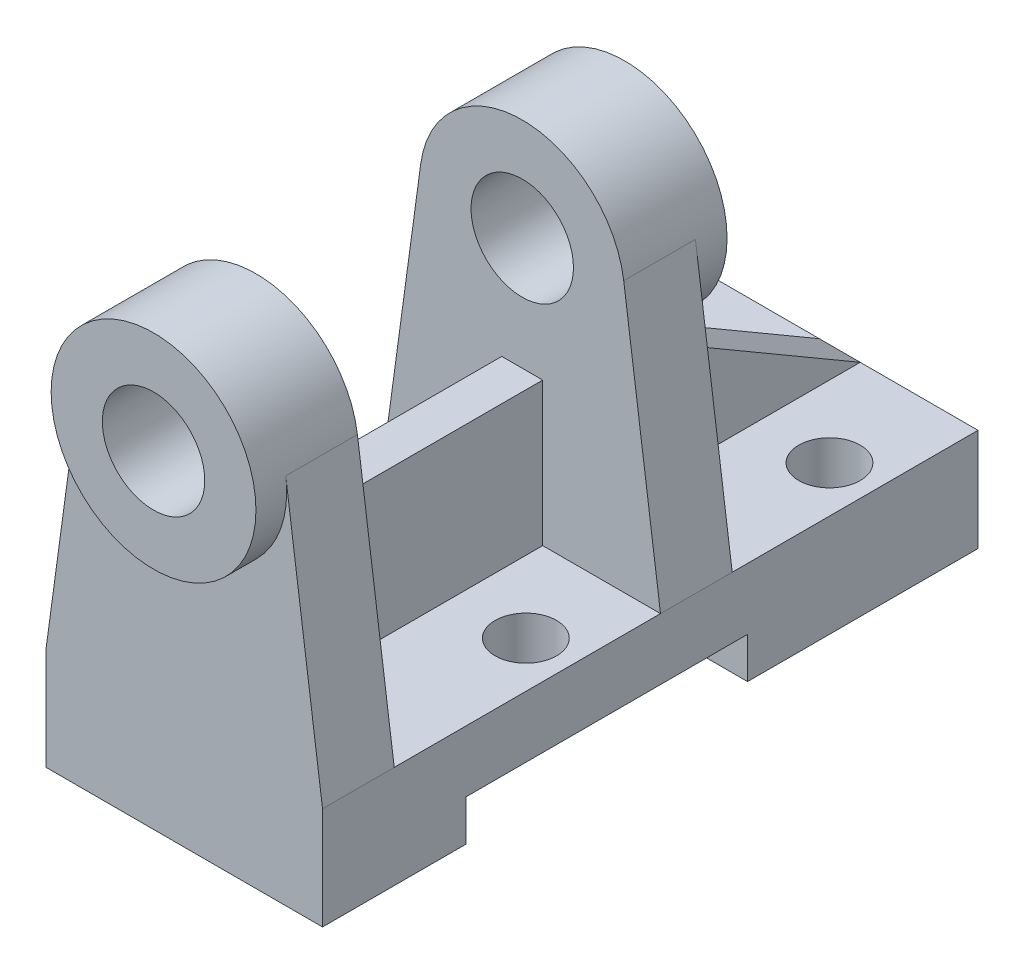
ISO-10303-21;
HEADER;
FILE_DESCRIPTION(('STEP AP214'),'2;1');
FILE_NAME('part.step','',(''),(''),'','','');
FILE_SCHEMA(('AUTOMOTIVE_DESIGN { 1 0 10303 214 1 1 1 1 }'));
ENDSEC;
DATA;
#1=APPLICATION_CONTEXT('core data for automotive mechanical design processes');
#2=APPLICATION_PROTOCOL_DEFINITION('international standard','automotive_design',2000,#1);
#3=PRODUCT_CONTEXT('',#1,'mechanical');
#4=PRODUCT('Part','Part','',(#3));
#5=PRODUCT_RELATED_PRODUCT_CATEGORY('part','',(#4));
#6=PRODUCT_DEFINITION_FORMATION('','',#4);
#7=PRODUCT_DEFINITION_CONTEXT('part definition',#1,'design');
#8=PRODUCT_DEFINITION('design','',#6,#7);
#9=PRODUCT_DEFINITION_SHAPE('','',#8);
#10=(LENGTH_UNIT() NAMED_UNIT(*) SI_UNIT(.MILLI.,.METRE.));
#11=(NAMED_UNIT(*) PLANE_ANGLE_UNIT() SI_UNIT($,.RADIAN.));
#12=(NAMED_UNIT(*) SI_UNIT($,.STERADIAN.) SOLID_ANGLE_UNIT());
#13=UNCERTAINTY_MEASURE_WITH_UNIT(LENGTH_MEASURE(1.E-05),#10,'distance_accuracy_value','');
#14=(GEOMETRIC_REPRESENTATION_CONTEXT(3) GLOBAL_UNCERTAINTY_ASSIGNED_CONTEXT((#13)) GLOBAL_UNIT_ASSIGNED_CONTEXT((#10,
#11,#12)) REPRESENTATION_CONTEXT('',''));
#15=CARTESIAN_POINT('',(0.,0.,0.));
#16=DIRECTION('',(0.,0.,1.));
#17=DIRECTION('',(1.,0.,0.));
#18=AXIS2_PLACEMENT_3D('',#15,#16,#17);
#19=CARTESIAN_POINT('',(27.,20.,0.));
#20=DIRECTION('',(0.,-1.,0.));
#21=DIRECTION('',(0.,0.,-1.));
#22=AXIS2_PLACEMENT_3D('',#19,#20,#21);
#23=PLANE('',#22);
#24=CARTESIAN_POINT('',(-18.,20.,-108.));
#25=DIRECTION('',(0.,1.,0.));
#26=DIRECTION('',(0.,0.,1.));
#27=AXIS2_PLACEMENT_3D('',#24,#25,#26);
#28=CIRCLE('',#27,6.00000000000002);
#29=CARTESIAN_POINT('',(-18.,20.,-102.));
#30=VERTEX_POINT('',#29);
#31=EDGE_CURVE('E227',#30,#30,#28,.T.);
#32=ORIENTED_EDGE('',*,*,#31,.F.);
#33=EDGE_LOOP('',(#32));
#34=FACE_BOUND('',#33,.T.);
#35=DIRECTION('',(0.,0.,-1.));
#36=VECTOR('',#35,1.);
#37=CARTESIAN_POINT('',(-4.,20.,-128.));
#38=LINE('',#37,#36);
#39=CARTESIAN_POINT('',(-4.,20.,-80.));
#40=VERTEX_POINT('',#39);
#41=CARTESIAN_POINT('',(-4.,20.,-128.));
#42=VERTEX_POINT('',#41);
#43=EDGE_CURVE('E63',#40,#42,#38,.T.);
#44=ORIENTED_EDGE('',*,*,#43,.T.);
#45=DIRECTION('',(-1.,0.,0.));
#46=VECTOR('',#45,1.);
#47=CARTESIAN_POINT('',(27.,20.,-128.));
#48=LINE('',#47,#46);
#49=CARTESIAN_POINT('',(-27.,20.,-128.));
#50=VERTEX_POINT('',#49);
#51=EDGE_CURVE('E438',#42,#50,#48,.T.);
#52=ORIENTED_EDGE('',*,*,#51,.T.);
#53=DIRECTION('',(0.,0.,1.));
#54=VECTOR('',#53,1.);
#55=CARTESIAN_POINT('',(-27.,20.,0.));
#56=LINE('',#55,#54);
#57=CARTESIAN_POINT('',(-27.,20.,-80.));
#58=VERTEX_POINT('',#57);
#59=EDGE_CURVE('E429',#50,#58,#56,.T.);
#60=ORIENTED_EDGE('',*,*,#59,.T.);
#61=DIRECTION('',(1.,0.,0.));
#62=VECTOR('',#61,1.);
#63=CARTESIAN_POINT('',(-27.,20.,-80.));
#64=LINE('',#63,#62);
#65=EDGE_CURVE('E298',#58,#40,#64,.T.);
#66=ORIENTED_EDGE('',*,*,#65,.T.);
#67=EDGE_LOOP('',(#44,#52,#60,#66));
#68=FACE_BOUND('',#67,.T.);
#69=ADVANCED_FACE('F45',(#34,#68),#23,.F.);
#70=CARTESIAN_POINT('',(18.,20.,-48.7));
#71=DIRECTION('',(0.,1.,0.));
#72=DIRECTION('',(0.,0.,1.));
#73=AXIS2_PLACEMENT_3D('',#70,#71,#72);
#74=CIRCLE('',#73,6.00000000000002);
#75=CARTESIAN_POINT('',(18.,20.,-42.7));
#76=VERTEX_POINT('',#75);
#77=EDGE_CURVE('E546',#76,#76,#74,.T.);
#78=ORIENTED_EDGE('',*,*,#77,.F.);
#79=EDGE_LOOP('',(#78));
#80=FACE_BOUND('',#79,.T.);
#81=DIRECTION('',(0.,0.,-1.));
#82=VECTOR('',#81,1.);
#83=CARTESIAN_POINT('',(4.,20.,-66.));
#84=LINE('',#83,#82);
#85=CARTESIAN_POINT('',(4.,20.,-14.));
#86=VERTEX_POINT('',#85);
#87=CARTESIAN_POINT('',(4.,20.,-66.));
#88=VERTEX_POINT('',#87);
#89=EDGE_CURVE('E239',#86,#88,#84,.T.);
#90=ORIENTED_EDGE('',*,*,#89,.F.);
#91=DIRECTION('',(1.,0.,0.));
#92=VECTOR('',#91,1.);
#93=CARTESIAN_POINT('',(27.,20.,-14.));
#94=LINE('',#93,#92);
#95=CARTESIAN_POINT('',(27.,20.,-14.));
#96=VERTEX_POINT('',#95);
#97=EDGE_CURVE('E350',#86,#96,#94,.T.);
#98=ORIENTED_EDGE('',*,*,#97,.T.);
#99=DIRECTION('',(0.,0.,1.));
#100=VECTOR('',#99,1.);
#101=CARTESIAN_POINT('',(27.,20.,0.));
#102=LINE('',#101,#100);
#103=CARTESIAN_POINT('',(27.,20.,-66.));
#104=VERTEX_POINT('',#103);
#105=EDGE_CURVE('E400',#104,#96,#102,.T.);
#106=ORIENTED_EDGE('',*,*,#105,.F.);
#107=DIRECTION('',(1.,0.,0.));
#108=VECTOR('',#107,1.);
#109=CARTESIAN_POINT('',(-27.,20.,-66.));
#110=LINE('',#109,#108);
#111=EDGE_CURVE('E309',#88,#104,#110,.T.);
#112=ORIENTED_EDGE('',*,*,#111,.F.);
#113=EDGE_LOOP('',(#90,#98,#106,#112));
#114=FACE_BOUND('',#113,.T.);
#115=ADVANCED_FACE('F493',(#80,#114),#23,.F.);
#116=CARTESIAN_POINT('',(0.,70.,-14.));
#117=DIRECTION('',(0.,0.,1.));
#118=DIRECTION('',(1.,0.,0.));
#119=AXIS2_PLACEMENT_3D('',#116,#117,#118);
#120=PLANE('',#119);
#121=CARTESIAN_POINT('',(0.,70.,-14.));
#122=DIRECTION('',(0.,0.,1.));
#123=DIRECTION('',(1.,0.,0.));
#124=AXIS2_PLACEMENT_3D('',#121,#122,#123);
#125=CIRCLE('',#124,10.);
#126=CARTESIAN_POINT('',(10.,70.,-14.));
#127=VERTEX_POINT('',#126);
#128=EDGE_CURVE('E280',#127,#127,#125,.T.);
#129=ORIENTED_EDGE('',*,*,#128,.T.);
#130=EDGE_LOOP('',(#129));
#131=FACE_BOUND('',#130,.T.);
#132=DIRECTION('',(0.,-1.,0.));
#133=VECTOR('',#132,1.);
#134=CARTESIAN_POINT('',(4.,20.,-14.));
#135=LINE('',#134,#133);
#136=CARTESIAN_POINT('',(4.,48.,-14.));
#137=VERTEX_POINT('',#136);
#138=EDGE_CURVE('E235',#137,#86,#135,.T.);
#139=ORIENTED_EDGE('',*,*,#138,.F.);
#140=DIRECTION('',(-1.,0.,0.));
#141=VECTOR('',#140,1.);
#142=CARTESIAN_POINT('',(4.,48.,-14.));
#143=LINE('',#142,#141);
#144=CARTESIAN_POINT('',(-4.,48.,-14.));
#145=VERTEX_POINT('',#144);
#146=EDGE_CURVE('E252',#137,#145,#143,.T.);
#147=ORIENTED_EDGE('',*,*,#146,.T.);
#148=DIRECTION('',(0.,-1.,0.));
#149=VECTOR('',#148,1.);
#150=CARTESIAN_POINT('',(-4.,20.,-14.));
#151=LINE('',#150,#149);
#152=CARTESIAN_POINT('',(-4.,20.,-14.));
#153=VERTEX_POINT('',#152);
#154=EDGE_CURVE('E234',#145,#153,#151,.T.);
#155=ORIENTED_EDGE('',*,*,#154,.T.);
#156=CARTESIAN_POINT('',(-27.,20.,-14.));
#157=VERTEX_POINT('',#156);
#158=EDGE_CURVE('E351',#157,#153,#94,.T.);
#159=ORIENTED_EDGE('',*,*,#158,.F.);
#160=DIRECTION('',(-0.135052741986063,-0.990838411085302,0.));
#161=VECTOR('',#160,1.);
#162=CARTESIAN_POINT('',(-19.8167682217061,72.7010548397213,-14.));
#163=LINE('',#162,#161);
#164=CARTESIAN_POINT('',(-19.8167682217061,72.7010548397213,-14.));
#165=VERTEX_POINT('',#164);
#166=EDGE_CURVE('E345',#165,#157,#163,.T.);
#167=ORIENTED_EDGE('',*,*,#166,.F.);
#168=CARTESIAN_POINT('',(0.,70.,-14.));
#169=DIRECTION('',(0.,0.,1.));
#170=DIRECTION('',(1.,0.,0.));
#171=AXIS2_PLACEMENT_3D('',#168,#169,#170);
#172=CIRCLE('',#171,20.);
#173=CARTESIAN_POINT('',(19.8167682217061,72.7010548397213,-14.));
#174=VERTEX_POINT('',#173);
#175=EDGE_CURVE('E337',#174,#165,#172,.T.);
#176=ORIENTED_EDGE('',*,*,#175,.F.);
#177=DIRECTION('',(-0.135052741986063,0.990838411085302,0.));
#178=VECTOR('',#177,1.);
#179=CARTESIAN_POINT('',(19.8167682217061,72.7010548397213,-14.));
#180=LINE('',#179,#178);
#181=EDGE_CURVE('E342',#96,#174,#180,.T.);
#182=ORIENTED_EDGE('',*,*,#181,.F.);
#183=ORIENTED_EDGE('',*,*,#97,.F.);
#184=EDGE_LOOP('',(#139,#147,#155,#159,#167,#176,#182,#183));
#185=FACE_BOUND('',#184,.T.);
#186=ADVANCED_FACE('F467',(#131,#185),#120,.F.);
#187=CARTESIAN_POINT('',(0.,70.,-66.));
#188=DIRECTION('',(0.,0.,1.));
#189=DIRECTION('',(1.,0.,0.));
#190=AXIS2_PLACEMENT_3D('',#187,#188,#189);
#191=PLANE('',#190);
#192=CARTESIAN_POINT('',(0.,70.,-66.));
#193=DIRECTION('',(0.,0.,1.));
#194=DIRECTION('',(1.,0.,0.));
#195=AXIS2_PLACEMENT_3D('',#192,#193,#194);
#196=CIRCLE('',#195,10.);
#197=CARTESIAN_POINT('',(10.,70.,-66.));
#198=VERTEX_POINT('',#197);
#199=EDGE_CURVE('E275',#198,#198,#196,.T.);
#200=ORIENTED_EDGE('',*,*,#199,.F.);
#201=EDGE_LOOP('',(#200));
#202=FACE_BOUND('',#201,.T.);
#203=DIRECTION('',(-1.,0.,0.));
#204=VECTOR('',#203,1.);
#205=CARTESIAN_POINT('',(4.,48.,-66.));
#206=LINE('',#205,#204);
#207=CARTESIAN_POINT('',(4.,48.,-66.));
#208=VERTEX_POINT('',#207);
#209=CARTESIAN_POINT('',(-4.,48.,-66.));
#210=VERTEX_POINT('',#209);
#211=EDGE_CURVE('E267',#208,#210,#206,.T.);
#212=ORIENTED_EDGE('',*,*,#211,.F.);
#213=DIRECTION('',(0.,1.,0.));
#214=VECTOR('',#213,1.);
#215=CARTESIAN_POINT('',(4.,48.,-66.));
#216=LINE('',#215,#214);
#217=EDGE_CURVE('E244',#88,#208,#216,.T.);
#218=ORIENTED_EDGE('',*,*,#217,.F.);
#219=ORIENTED_EDGE('',*,*,#111,.T.);
#220=DIRECTION('',(-0.135052741986063,0.990838411085302,0.));
#221=VECTOR('',#220,1.);
#222=CARTESIAN_POINT('',(27.,20.,-66.));
#223=LINE('',#222,#221);
#224=CARTESIAN_POINT('',(19.8167682217061,72.7010548397213,-66.));
#225=VERTEX_POINT('',#224);
#226=EDGE_CURVE('E313',#104,#225,#223,.T.);
#227=ORIENTED_EDGE('',*,*,#226,.T.);
#228=CARTESIAN_POINT('',(0.,70.,-66.));
#229=DIRECTION('',(0.,0.,1.));
#230=DIRECTION('',(1.,0.,0.));
#231=AXIS2_PLACEMENT_3D('',#228,#229,#230);
#232=CIRCLE('',#231,20.);
#233=CARTESIAN_POINT('',(-19.8167682217061,72.7010548397213,-66.));
#234=VERTEX_POINT('',#233);
#235=EDGE_CURVE('E297',#225,#234,#232,.T.);
#236=ORIENTED_EDGE('',*,*,#235,.T.);
#237=DIRECTION('',(-0.135052741986063,-0.990838411085302,0.));
#238=VECTOR('',#237,1.);
#239=CARTESIAN_POINT('',(-19.8167682217061,72.7010548397213,-66.));
#240=LINE('',#239,#238);
#241=CARTESIAN_POINT('',(-27.,20.,-66.));
#242=VERTEX_POINT('',#241);
#243=EDGE_CURVE('E291',#234,#242,#240,.T.);
#244=ORIENTED_EDGE('',*,*,#243,.T.);
#245=CARTESIAN_POINT('',(-4.,20.,-66.));
#246=VERTEX_POINT('',#245);
#247=EDGE_CURVE('E310',#242,#246,#110,.T.);
#248=ORIENTED_EDGE('',*,*,#247,.T.);
#249=DIRECTION('',(0.,1.,0.));
#250=VECTOR('',#249,1.);
#251=CARTESIAN_POINT('',(-4.,48.,-66.));
#252=LINE('',#251,#250);
#253=EDGE_CURVE('E259',#246,#210,#252,.T.);
#254=ORIENTED_EDGE('',*,*,#253,.T.);
#255=EDGE_LOOP('',(#212,#218,#219,#227,#236,#244,#248,#254));
#256=FACE_BOUND('',#255,.T.);
#257=ADVANCED_FACE('F463',(#202,#256),#191,.T.);
#258=CARTESIAN_POINT('',(18.,20.,-108.));
#259=DIRECTION('',(0.,1.,0.));
#260=DIRECTION('',(0.,0.,1.));
#261=AXIS2_PLACEMENT_3D('',#258,#259,#260);
#262=CIRCLE('',#261,6.00000000000002);
#263=CARTESIAN_POINT('',(18.,20.,-102.));
#264=VERTEX_POINT('',#263);
#265=EDGE_CURVE('E534',#264,#264,#262,.T.);
#266=ORIENTED_EDGE('',*,*,#265,.F.);
#267=EDGE_LOOP('',(#266));
#268=FACE_BOUND('',#267,.T.);
#269=CARTESIAN_POINT('',(27.,20.,-128.));
#270=VERTEX_POINT('',#269);
#271=CARTESIAN_POINT('',(4.,20.,-128.));
#272=VERTEX_POINT('',#271);
#273=EDGE_CURVE('E439',#270,#272,#48,.T.);
#274=ORIENTED_EDGE('',*,*,#273,.T.);
#275=DIRECTION('',(0.,0.,-1.));
#276=VECTOR('',#275,1.);
#277=CARTESIAN_POINT('',(4.,20.,-128.));
#278=LINE('',#277,#276);
#279=CARTESIAN_POINT('',(4.,20.,-80.));
#280=VERTEX_POINT('',#279);
#281=EDGE_CURVE('E522',#280,#272,#278,.T.);
#282=ORIENTED_EDGE('',*,*,#281,.F.);
#283=CARTESIAN_POINT('',(27.,20.,-80.));
#284=VERTEX_POINT('',#283);
#285=EDGE_CURVE('E296',#280,#284,#64,.T.);
#286=ORIENTED_EDGE('',*,*,#285,.T.);
#287=EDGE_CURVE('E401',#270,#284,#102,.T.);
#288=ORIENTED_EDGE('',*,*,#287,.F.);
#289=EDGE_LOOP('',(#274,#282,#286,#288));
#290=FACE_BOUND('',#289,.T.);
#291=ADVANCED_FACE('F466',(#268,#290),#23,.F.);
#292=CARTESIAN_POINT('',(27.,0.,-28.));
#293=DIRECTION('',(0.,1.,0.));
#294=DIRECTION('',(0.,0.,1.));
#295=AXIS2_PLACEMENT_3D('',#292,#293,#294);
#296=PLANE('',#295);
#297=DIRECTION('',(0.,0.,-1.));
#298=VECTOR('',#297,1.);
#299=CARTESIAN_POINT('',(-27.,0.,-28.));
#300=LINE('',#299,#298);
#301=CARTESIAN_POINT('',(-27.,0.,0.));
#302=VERTEX_POINT('',#301);
#303=CARTESIAN_POINT('',(-27.,0.,-28.));
#304=VERTEX_POINT('',#303);
#305=EDGE_CURVE('E370',#302,#304,#300,.T.);
#306=ORIENTED_EDGE('',*,*,#305,.T.);
#307=DIRECTION('',(-1.,0.,0.));
#308=VECTOR('',#307,1.);
#309=CARTESIAN_POINT('',(27.,0.,-28.));
#310=LINE('',#309,#308);
#311=CARTESIAN_POINT('',(27.,0.,-28.));
#312=VERTEX_POINT('',#311);
#313=EDGE_CURVE('E11',#312,#304,#310,.T.);
#314=ORIENTED_EDGE('',*,*,#313,.F.);
#315=DIRECTION('',(0.,0.,-1.));
#316=VECTOR('',#315,1.);
#317=CARTESIAN_POINT('',(27.,0.,-28.));
#318=LINE('',#317,#316);
#319=CARTESIAN_POINT('',(27.,0.,0.));
#320=VERTEX_POINT('',#319);
#321=EDGE_CURVE('E380',#320,#312,#318,.T.);
#322=ORIENTED_EDGE('',*,*,#321,.F.);
#323=DIRECTION('',(-1.,0.,0.));
#324=VECTOR('',#323,1.);
#325=CARTESIAN_POINT('',(27.,0.,0.));
#326=LINE('',#325,#324);
#327=EDGE_CURVE('E408',#320,#302,#326,.T.);
#328=ORIENTED_EDGE('',*,*,#327,.T.);
#329=EDGE_LOOP('',(#306,#314,#322,#328));
#330=FACE_BOUND('',#329,.T.);
#331=ADVANCED_FACE('F47',(#330),#296,.F.);
#332=CARTESIAN_POINT('',(27.,7.99999999999999,-28.));
#333=DIRECTION('',(0.,0.,1.));
#334=DIRECTION('',(1.,0.,0.));
#335=AXIS2_PLACEMENT_3D('',#332,#333,#334);
#336=PLANE('',#335);
#337=DIRECTION('',(0.,1.,0.));
#338=VECTOR('',#337,1.);
#339=CARTESIAN_POINT('',(-27.,7.99999999999999,-28.));
#340=LINE('',#339,#338);
#341=CARTESIAN_POINT('',(-27.,7.99999999999999,-28.));
#342=VERTEX_POINT('',#341);
#343=EDGE_CURVE('E412',#304,#342,#340,.T.);
#344=ORIENTED_EDGE('',*,*,#343,.T.);
#345=DIRECTION('',(-1.,0.,0.));
#346=VECTOR('',#345,1.);
#347=CARTESIAN_POINT('',(27.,7.99999999999999,-28.));
#348=LINE('',#347,#346);
#349=CARTESIAN_POINT('',(27.,7.99999999999999,-28.));
#350=VERTEX_POINT('',#349);
#351=EDGE_CURVE('E55',#350,#342,#348,.T.);
#352=ORIENTED_EDGE('',*,*,#351,.F.);
#353=DIRECTION('',(0.,1.,0.));
#354=VECTOR('',#353,1.);
#355=CARTESIAN_POINT('',(27.,7.99999999999999,-28.));
#356=LINE('',#355,#354);
#357=EDGE_CURVE('E384',#312,#350,#356,.T.);
#358=ORIENTED_EDGE('',*,*,#357,.F.);
#359=ORIENTED_EDGE('',*,*,#313,.T.);
#360=EDGE_LOOP('',(#344,#352,#358,#359));
#361=FACE_BOUND('',#360,.T.);
#362=ADVANCED_FACE('F599',(#361),#336,.F.);
#363=CARTESIAN_POINT('',(27.,7.99999999999999,-83.));
#364=DIRECTION('',(0.,1.,0.));
#365=DIRECTION('',(0.,0.,1.));
#366=AXIS2_PLACEMENT_3D('',#363,#364,#365);
#367=PLANE('',#366);
#368=CARTESIAN_POINT('',(18.,7.99999999999999,-48.7));
#369=DIRECTION('',(0.,1.,0.));
#370=DIRECTION('',(0.,0.,1.));
#371=AXIS2_PLACEMENT_3D('',#368,#369,#370);
#372=CIRCLE('',#371,6.00000000000001);
#373=CARTESIAN_POINT('',(18.,7.99999999999999,-42.7));
#374=VERTEX_POINT('',#373);
#375=EDGE_CURVE('E49',#374,#374,#372,.T.);
#376=ORIENTED_EDGE('',*,*,#375,.T.);
#377=EDGE_LOOP('',(#376));
#378=FACE_BOUND('',#377,.T.);
#379=CARTESIAN_POINT('',(-18.,7.99999999999999,-48.7));
#380=DIRECTION('',(0.,1.,0.));
#381=DIRECTION('',(0.,0.,1.));
#382=AXIS2_PLACEMENT_3D('',#379,#380,#381);
#383=CIRCLE('',#382,6.00000000000001);
#384=CARTESIAN_POINT('',(-18.,7.99999999999999,-42.7));
#385=VERTEX_POINT('',#384);
#386=EDGE_CURVE('E538',#385,#385,#383,.T.);
#387=ORIENTED_EDGE('',*,*,#386,.T.);
#388=EDGE_LOOP('',(#387));
#389=FACE_BOUND('',#388,.T.);
#390=DIRECTION('',(0.,0.,-1.));
#391=VECTOR('',#390,1.);
#392=CARTESIAN_POINT('',(-27.,7.99999999999999,-83.));
#393=LINE('',#392,#391);
#394=CARTESIAN_POINT('',(-27.,7.99999999999999,-83.));
#395=VERTEX_POINT('',#394);
#396=EDGE_CURVE('E415',#342,#395,#393,.T.);
#397=ORIENTED_EDGE('',*,*,#396,.T.);
#398=DIRECTION('',(-1.,0.,0.));
#399=VECTOR('',#398,1.);
#400=CARTESIAN_POINT('',(27.,7.99999999999999,-83.));
#401=LINE('',#400,#399);
#402=CARTESIAN_POINT('',(27.,7.99999999999999,-83.));
#403=VERTEX_POINT('',#402);
#404=EDGE_CURVE('E450',#403,#395,#401,.T.);
#405=ORIENTED_EDGE('',*,*,#404,.F.);
#406=DIRECTION('',(0.,0.,-1.));
#407=VECTOR('',#406,1.);
#408=CARTESIAN_POINT('',(27.,7.99999999999999,-83.));
#409=LINE('',#408,#407);
#410=EDGE_CURVE('E388',#350,#403,#409,.T.);
#411=ORIENTED_EDGE('',*,*,#410,.F.);
#412=ORIENTED_EDGE('',*,*,#351,.T.);
#413=EDGE_LOOP('',(#397,#405,#411,#412));
#414=FACE_BOUND('',#413,.T.);
#415=ADVANCED_FACE('F555',(#378,#389,#414),#367,.F.);
#416=CARTESIAN_POINT('',(27.,0.,-83.));
#417=DIRECTION('',(0.,0.,-1.));
#418=DIRECTION('',(-1.,0.,0.));
#419=AXIS2_PLACEMENT_3D('',#416,#417,#418);
#420=PLANE('',#419);
#421=DIRECTION('',(0.,-1.,0.));
#422=VECTOR('',#421,1.);
#423=CARTESIAN_POINT('',(-27.,0.,-83.));
#424=LINE('',#423,#422);
#425=CARTESIAN_POINT('',(-27.,0.,-83.));
#426=VERTEX_POINT('',#425);
#427=EDGE_CURVE('E418',#395,#426,#424,.T.);
#428=ORIENTED_EDGE('',*,*,#427,.T.);
#429=DIRECTION('',(-1.,0.,0.));
#430=VECTOR('',#429,1.);
#431=CARTESIAN_POINT('',(27.,0.,-83.));
#432=LINE('',#431,#430);
#433=CARTESIAN_POINT('',(27.,0.,-83.));
#434=VERTEX_POINT('',#433);
#435=EDGE_CURVE('E446',#434,#426,#432,.T.);
#436=ORIENTED_EDGE('',*,*,#435,.F.);
#437=DIRECTION('',(0.,-1.,0.));
#438=VECTOR('',#437,1.);
#439=CARTESIAN_POINT('',(27.,0.,-83.));
#440=LINE('',#439,#438);
#441=EDGE_CURVE('E391',#403,#434,#440,.T.);
#442=ORIENTED_EDGE('',*,*,#441,.F.);
#443=ORIENTED_EDGE('',*,*,#404,.T.);
#444=EDGE_LOOP('',(#428,#436,#442,#443));
#445=FACE_BOUND('',#444,.T.);
#446=ADVANCED_FACE('F813',(#445),#420,.F.);
#447=CARTESIAN_POINT('',(27.,0.,-128.));
#448=DIRECTION('',(0.,1.,0.));
#449=DIRECTION('',(0.,0.,1.));
#450=AXIS2_PLACEMENT_3D('',#447,#448,#449);
#451=PLANE('',#450);
#452=CARTESIAN_POINT('',(18.,0.,-108.));
#453=DIRECTION('',(0.,1.,0.));
#454=DIRECTION('',(0.,0.,1.));
#455=AXIS2_PLACEMENT_3D('',#452,#453,#454);
#456=CIRCLE('',#455,6.00000000000001);
#457=CARTESIAN_POINT('',(18.,0.,-102.));
#458=VERTEX_POINT('',#457);
#459=EDGE_CURVE('E530',#458,#458,#456,.T.);
#460=ORIENTED_EDGE('',*,*,#459,.T.);
#461=EDGE_LOOP('',(#460));
#462=FACE_BOUND('',#461,.T.);
#463=CARTESIAN_POINT('',(-18.,0.,-108.));
#464=DIRECTION('',(0.,1.,0.));
#465=DIRECTION('',(0.,0.,1.));
#466=AXIS2_PLACEMENT_3D('',#463,#464,#465);
#467=CIRCLE('',#466,6.00000000000001);
#468=CARTESIAN_POINT('',(-18.,0.,-102.));
#469=VERTEX_POINT('',#468);
#470=EDGE_CURVE('E221',#469,#469,#467,.T.);
#471=ORIENTED_EDGE('',*,*,#470,.T.);
#472=EDGE_LOOP('',(#471));
#473=FACE_BOUND('',#472,.T.);
#474=DIRECTION('',(0.,0.,-1.));
#475=VECTOR('',#474,1.);
#476=CARTESIAN_POINT('',(-27.,0.,-128.));
#477=LINE('',#476,#475);
#478=CARTESIAN_POINT('',(-27.,0.,-128.));
#479=VERTEX_POINT('',#478);
#480=EDGE_CURVE('E421',#426,#479,#477,.T.);
#481=ORIENTED_EDGE('',*,*,#480,.T.);
#482=DIRECTION('',(-1.,0.,0.));
#483=VECTOR('',#482,1.);
#484=CARTESIAN_POINT('',(27.,0.,-128.));
#485=LINE('',#484,#483);
#486=CARTESIAN_POINT('',(27.,0.,-128.));
#487=VERTEX_POINT('',#486);
#488=EDGE_CURVE('E442',#487,#479,#485,.T.);
#489=ORIENTED_EDGE('',*,*,#488,.F.);
#490=DIRECTION('',(0.,0.,-1.));
#491=VECTOR('',#490,1.);
#492=CARTESIAN_POINT('',(27.,0.,-128.));
#493=LINE('',#492,#491);
#494=EDGE_CURVE('E394',#434,#487,#493,.T.);
#495=ORIENTED_EDGE('',*,*,#494,.F.);
#496=ORIENTED_EDGE('',*,*,#435,.T.);
#497=EDGE_LOOP('',(#481,#489,#495,#496));
#498=FACE_BOUND('',#497,.T.);
#499=ADVANCED_FACE('F591',(#462,#473,#498),#451,.F.);
#500=CARTESIAN_POINT('',(27.,20.,-128.));
#501=DIRECTION('',(0.,0.,1.));
#502=DIRECTION('',(1.,0.,0.));
#503=AXIS2_PLACEMENT_3D('',#500,#501,#502);
#504=PLANE('',#503);
#505=DIRECTION('',(0.,1.,0.));
#506=VECTOR('',#505,1.);
#507=CARTESIAN_POINT('',(-27.,20.,-128.));
#508=LINE('',#507,#506);
#509=EDGE_CURVE('E424',#479,#50,#508,.T.);
#510=ORIENTED_EDGE('',*,*,#509,.T.);
#511=ORIENTED_EDGE('',*,*,#51,.F.);
#512=DIRECTION('',(-1.,0.,0.));
#513=VECTOR('',#512,1.);
#514=CARTESIAN_POINT('',(4.,20.,-128.));
#515=LINE('',#514,#513);
#516=EDGE_CURVE('E70',#272,#42,#515,.T.);
#517=ORIENTED_EDGE('',*,*,#516,.F.);
#518=ORIENTED_EDGE('',*,*,#273,.F.);
#519=DIRECTION('',(0.,1.,0.));
#520=VECTOR('',#519,1.);
#521=CARTESIAN_POINT('',(27.,20.,-128.));
#522=LINE('',#521,#520);
#523=EDGE_CURVE('E397',#487,#270,#522,.T.);
#524=ORIENTED_EDGE('',*,*,#523,.F.);
#525=ORIENTED_EDGE('',*,*,#488,.T.);
#526=EDGE_LOOP('',(#510,#511,#517,#518,#524,#525));
#527=FACE_BOUND('',#526,.T.);
#528=ADVANCED_FACE('F583',(#527),#504,.F.);
#529=CARTESIAN_POINT('',(-18.,20.,-48.7));
#530=DIRECTION('',(0.,1.,0.));
#531=DIRECTION('',(0.,0.,1.));
#532=AXIS2_PLACEMENT_3D('',#529,#530,#531);
#533=CIRCLE('',#532,6.00000000000002);
#534=CARTESIAN_POINT('',(-18.,20.,-42.7));
#535=VERTEX_POINT('',#534);
#536=EDGE_CURVE('E542',#535,#535,#533,.T.);
#537=ORIENTED_EDGE('',*,*,#536,.F.);
#538=EDGE_LOOP('',(#537));
#539=FACE_BOUND('',#538,.T.);
#540=ORIENTED_EDGE('',*,*,#158,.T.);
#541=DIRECTION('',(0.,0.,-1.));
#542=VECTOR('',#541,1.);
#543=CARTESIAN_POINT('',(-4.,20.,-66.));
#544=LINE('',#543,#542);
#545=EDGE_CURVE('E255',#153,#246,#544,.T.);
#546=ORIENTED_EDGE('',*,*,#545,.T.);
#547=ORIENTED_EDGE('',*,*,#247,.F.);
#548=EDGE_CURVE('E428',#242,#157,#56,.T.);
#549=ORIENTED_EDGE('',*,*,#548,.T.);
#550=EDGE_LOOP('',(#540,#546,#547,#549));
#551=FACE_BOUND('',#550,.T.);
#552=ADVANCED_FACE('F571',(#539,#551),#23,.F.);
#553=CARTESIAN_POINT('',(27.,0.,0.));
#554=DIRECTION('',(0.,0.,-1.));
#555=DIRECTION('',(-1.,0.,0.));
#556=AXIS2_PLACEMENT_3D('',#553,#554,#555);
#557=PLANE('',#556);
#558=DIRECTION('',(0.,-1.,0.));
#559=VECTOR('',#558,1.);
#560=CARTESIAN_POINT('',(-27.,0.,0.));
#561=LINE('',#560,#559);
#562=CARTESIAN_POINT('',(-27.,20.,0.));
#563=VERTEX_POINT('',#562);
#564=EDGE_CURVE('E385',#563,#302,#561,.T.);
#565=ORIENTED_EDGE('',*,*,#564,.T.);
#566=ORIENTED_EDGE('',*,*,#327,.F.);
#567=DIRECTION('',(0.,-1.,0.));
#568=VECTOR('',#567,1.);
#569=CARTESIAN_POINT('',(27.,0.,0.));
#570=LINE('',#569,#568);
#571=CARTESIAN_POINT('',(27.,20.,0.));
#572=VERTEX_POINT('',#571);
#573=EDGE_CURVE('E405',#572,#320,#570,.T.);
#574=ORIENTED_EDGE('',*,*,#573,.F.);
#575=DIRECTION('',(-0.135052741986063,0.990838411085302,0.));
#576=VECTOR('',#575,1.);
#577=CARTESIAN_POINT('',(19.8167682217061,72.7010548397213,0.));
#578=LINE('',#577,#576);
#579=CARTESIAN_POINT('',(19.8167682217061,72.7010548397213,0.));
#580=VERTEX_POINT('',#579);
#581=EDGE_CURVE('E341',#572,#580,#578,.T.);
#582=ORIENTED_EDGE('',*,*,#581,.T.);
#583=CARTESIAN_POINT('',(0.,70.,0.));
#584=DIRECTION('',(0.,0.,-1.));
#585=DIRECTION('',(1.,0.,0.));
#586=AXIS2_PLACEMENT_3D('',#583,#584,#585);
#587=CIRCLE('',#586,20.);
#588=CARTESIAN_POINT('',(-19.8167682217061,72.7010548397213,0.));
#589=VERTEX_POINT('',#588);
#590=EDGE_CURVE('E359',#580,#589,#587,.T.);
#591=ORIENTED_EDGE('',*,*,#590,.T.);
#592=DIRECTION('',(-0.135052741986063,-0.990838411085302,0.));
#593=VECTOR('',#592,1.);
#594=CARTESIAN_POINT('',(-19.8167682217061,72.7010548397213,0.));
#595=LINE('',#594,#593);
#596=EDGE_CURVE('E346',#589,#563,#595,.T.);
#597=ORIENTED_EDGE('',*,*,#596,.T.);
#598=EDGE_LOOP('',(#565,#566,#574,#582,#591,#597));
#599=FACE_BOUND('',#598,.T.);
#600=ADVANCED_FACE('F582',(#599),#557,.F.);
#601=CARTESIAN_POINT('',(27.,0.,0.));
#602=DIRECTION('',(-1.,0.,0.));
#603=DIRECTION('',(0.,0.,1.));
#604=AXIS2_PLACEMENT_3D('',#601,#602,#603);
#605=PLANE('',#604);
#606=ORIENTED_EDGE('',*,*,#321,.T.);
#607=ORIENTED_EDGE('',*,*,#357,.T.);
#608=ORIENTED_EDGE('',*,*,#410,.T.);
#609=ORIENTED_EDGE('',*,*,#441,.T.);
#610=ORIENTED_EDGE('',*,*,#494,.T.);
#611=ORIENTED_EDGE('',*,*,#523,.T.);
#612=ORIENTED_EDGE('',*,*,#287,.T.);
#613=DIRECTION('',(0.,0.,1.));
#614=VECTOR('',#613,1.);
#615=CARTESIAN_POINT('',(27.,20.,-80.));
#616=LINE('',#615,#614);
#617=EDGE_CURVE('E327',#284,#104,#616,.T.);
#618=ORIENTED_EDGE('',*,*,#617,.T.);
#619=ORIENTED_EDGE('',*,*,#105,.T.);
#620=DIRECTION('',(0.,0.,1.));
#621=VECTOR('',#620,1.);
#622=CARTESIAN_POINT('',(27.,20.,-14.));
#623=LINE('',#622,#621);
#624=EDGE_CURVE('E366',#96,#572,#623,.T.);
#625=ORIENTED_EDGE('',*,*,#624,.T.);
#626=ORIENTED_EDGE('',*,*,#573,.T.);
#627=EDGE_LOOP('',(#606,#607,#608,#609,#610,#611,#612,#618,#619,#625,#626));
#628=FACE_BOUND('',#627,.T.);
#629=ADVANCED_FACE('F497',(#628),#605,.F.);
#630=CARTESIAN_POINT('',(-27.,0.,0.));
#631=DIRECTION('',(-1.,0.,0.));
#632=DIRECTION('',(0.,0.,1.));
#633=AXIS2_PLACEMENT_3D('',#630,#631,#632);
#634=PLANE('',#633);
#635=ORIENTED_EDGE('',*,*,#305,.F.);
#636=ORIENTED_EDGE('',*,*,#564,.F.);
#637=DIRECTION('',(0.,0.,1.));
#638=VECTOR('',#637,1.);
#639=CARTESIAN_POINT('',(-27.,20.,-14.));
#640=LINE('',#639,#638);
#641=EDGE_CURVE('E371',#157,#563,#640,.T.);
#642=ORIENTED_EDGE('',*,*,#641,.F.);
#643=ORIENTED_EDGE('',*,*,#548,.F.);
#644=DIRECTION('',(0.,0.,1.));
#645=VECTOR('',#644,1.);
#646=CARTESIAN_POINT('',(-27.,20.,-80.));
#647=LINE('',#646,#645);
#648=EDGE_CURVE('E305',#58,#242,#647,.T.);
#649=ORIENTED_EDGE('',*,*,#648,.F.);
#650=ORIENTED_EDGE('',*,*,#59,.F.);
#651=ORIENTED_EDGE('',*,*,#509,.F.);
#652=ORIENTED_EDGE('',*,*,#480,.F.);
#653=ORIENTED_EDGE('',*,*,#427,.F.);
#654=ORIENTED_EDGE('',*,*,#396,.F.);
#655=ORIENTED_EDGE('',*,*,#343,.F.);
#656=EDGE_LOOP('',(#635,#636,#642,#643,#649,#650,#651,#652,#653,#654,#655));
#657=FACE_BOUND('',#656,.T.);
#658=ADVANCED_FACE('F515',(#657),#634,.T.);
#659=CARTESIAN_POINT('',(19.8167682217061,72.7010548397213,-14.));
#660=DIRECTION('',(0.990838411085302,0.135052741986063,0.));
#661=DIRECTION('',(-0.135052741986063,0.990838411085302,0.));
#662=AXIS2_PLACEMENT_3D('',#659,#660,#661);
#663=PLANE('',#662);
#664=ORIENTED_EDGE('',*,*,#581,.F.);
#665=ORIENTED_EDGE('',*,*,#624,.F.);
#666=ORIENTED_EDGE('',*,*,#181,.T.);
#667=DIRECTION('',(0.,0.,1.));
#668=VECTOR('',#667,1.);
#669=CARTESIAN_POINT('',(19.8167682217061,72.7010548397213,-14.));
#670=LINE('',#669,#668);
#671=EDGE_CURVE('E355',#174,#580,#670,.T.);
#672=ORIENTED_EDGE('',*,*,#671,.T.);
#673=EDGE_LOOP('',(#664,#665,#666,#672));
#674=FACE_BOUND('',#673,.T.);
#675=ADVANCED_FACE('F628',(#674),#663,.T.);
#676=CARTESIAN_POINT('',(-19.8167682217061,72.7010548397213,-14.));
#677=DIRECTION('',(-0.990838411085302,0.135052741986063,0.));
#678=DIRECTION('',(-0.135052741986063,-0.990838411085302,0.));
#679=AXIS2_PLACEMENT_3D('',#676,#677,#678);
#680=PLANE('',#679);
#681=ORIENTED_EDGE('',*,*,#596,.F.);
#682=DIRECTION('',(0.,0.,1.));
#683=VECTOR('',#682,1.);
#684=CARTESIAN_POINT('',(-19.8167682217061,72.7010548397213,-14.));
#685=LINE('',#684,#683);
#686=EDGE_CURVE('E374',#165,#589,#685,.T.);
#687=ORIENTED_EDGE('',*,*,#686,.F.);
#688=ORIENTED_EDGE('',*,*,#166,.T.);
#689=ORIENTED_EDGE('',*,*,#641,.T.);
#690=EDGE_LOOP('',(#681,#687,#688,#689));
#691=FACE_BOUND('',#690,.T.);
#692=ADVANCED_FACE('F616',(#691),#680,.T.);
#693=CARTESIAN_POINT('',(0.,70.,-14.));
#694=DIRECTION('',(0.,0.,1.));
#695=DIRECTION('',(1.,0.,0.));
#696=AXIS2_PLACEMENT_3D('',#693,#694,#695);
#697=CYLINDRICAL_SURFACE('',#696,20.);
#698=CARTESIAN_POINT('',(0.,70.,6.));
#699=DIRECTION('',(0.,0.,1.));
#700=DIRECTION('',(1.,0.,0.));
#701=AXIS2_PLACEMENT_3D('',#698,#699,#700);
#702=CIRCLE('',#701,20.);
#703=CARTESIAN_POINT('',(20.,70.,6.));
#704=VERTEX_POINT('',#703);
#705=EDGE_CURVE('E323',#704,#704,#702,.T.);
#706=ORIENTED_EDGE('',*,*,#705,.F.);
#707=EDGE_LOOP('',(#706));
#708=FACE_BOUND('',#707,.T.);
#709=ORIENTED_EDGE('',*,*,#671,.F.);
#710=ORIENTED_EDGE('',*,*,#175,.T.);
#711=ORIENTED_EDGE('',*,*,#686,.T.);
#712=ORIENTED_EDGE('',*,*,#590,.F.);
#713=EDGE_LOOP('',(#709,#710,#711,#712));
#714=FACE_BOUND('',#713,.T.);
#715=ADVANCED_FACE('F627',(#708,#714),#697,.T.);
#716=CARTESIAN_POINT('',(0.,70.,6.));
#717=DIRECTION('',(0.,0.,1.));
#718=DIRECTION('',(1.,0.,0.));
#719=AXIS2_PLACEMENT_3D('',#716,#717,#718);
#720=PLANE('',#719);
#721=CARTESIAN_POINT('',(0.,70.,6.));
#722=DIRECTION('',(0.,0.,1.));
#723=DIRECTION('',(1.,0.,0.));
#724=AXIS2_PLACEMENT_3D('',#721,#722,#723);
#725=CIRCLE('',#724,10.);
#726=CARTESIAN_POINT('',(10.,70.,6.));
#727=VERTEX_POINT('',#726);
#728=EDGE_CURVE('E271',#727,#727,#725,.T.);
#729=ORIENTED_EDGE('',*,*,#728,.F.);
#730=EDGE_LOOP('',(#729));
#731=FACE_BOUND('',#730,.T.);
#732=ORIENTED_EDGE('',*,*,#705,.T.);
#733=EDGE_LOOP('',(#732));
#734=FACE_BOUND('',#733,.T.);
#735=ADVANCED_FACE('F658',(#731,#734),#720,.T.);
#736=CARTESIAN_POINT('',(-19.8167682217061,72.7010548397213,-80.));
#737=DIRECTION('',(-0.990838411085302,0.135052741986063,0.));
#738=DIRECTION('',(-0.135052741986063,-0.990838411085302,0.));
#739=AXIS2_PLACEMENT_3D('',#736,#737,#738);
#740=PLANE('',#739);
#741=ORIENTED_EDGE('',*,*,#243,.F.);
#742=DIRECTION('',(0.,0.,1.));
#743=VECTOR('',#742,1.);
#744=CARTESIAN_POINT('',(-19.8167682217061,72.7010548397213,-80.));
#745=LINE('',#744,#743);
#746=CARTESIAN_POINT('',(-19.8167682217061,72.7010548397213,-80.));
#747=VERTEX_POINT('',#746);
#748=EDGE_CURVE('E320',#747,#234,#745,.T.);
#749=ORIENTED_EDGE('',*,*,#748,.F.);
#750=DIRECTION('',(-0.135052741986063,-0.990838411085302,0.));
#751=VECTOR('',#750,1.);
#752=CARTESIAN_POINT('',(-19.8167682217061,72.7010548397213,-80.));
#753=LINE('',#752,#751);
#754=EDGE_CURVE('E292',#747,#58,#753,.T.);
#755=ORIENTED_EDGE('',*,*,#754,.T.);
#756=ORIENTED_EDGE('',*,*,#648,.T.);
#757=EDGE_LOOP('',(#741,#749,#755,#756));
#758=FACE_BOUND('',#757,.T.);
#759=ADVANCED_FACE('F510',(#758),#740,.T.);
#760=CARTESIAN_POINT('',(0.,70.,-80.));
#761=DIRECTION('',(0.,0.,1.));
#762=DIRECTION('',(1.,0.,0.));
#763=AXIS2_PLACEMENT_3D('',#760,#761,#762);
#764=CYLINDRICAL_SURFACE('',#763,20.);
#765=ORIENTED_EDGE('',*,*,#235,.F.);
#766=DIRECTION('',(0.,0.,1.));
#767=VECTOR('',#766,1.);
#768=CARTESIAN_POINT('',(19.8167682217061,72.7010548397213,-80.));
#769=LINE('',#768,#767);
#770=CARTESIAN_POINT('',(19.8167682217061,72.7010548397213,-80.));
#771=VERTEX_POINT('',#770);
#772=EDGE_CURVE('E324',#771,#225,#769,.T.);
#773=ORIENTED_EDGE('',*,*,#772,.F.);
#774=CARTESIAN_POINT('',(0.,70.,-80.));
#775=DIRECTION('',(0.,0.,1.));
#776=DIRECTION('',(1.,0.,0.));
#777=AXIS2_PLACEMENT_3D('',#774,#775,#776);
#778=CIRCLE('',#777,20.);
#779=EDGE_CURVE('E288',#747,#771,#778,.T.);
#780=ORIENTED_EDGE('',*,*,#779,.F.);
#781=ORIENTED_EDGE('',*,*,#748,.T.);
#782=EDGE_LOOP('',(#765,#773,#780,#781));
#783=FACE_BOUND('',#782,.T.);
#784=CARTESIAN_POINT('',(0.,70.,-86.));
#785=DIRECTION('',(0.,0.,1.));
#786=DIRECTION('',(1.,0.,0.));
#787=AXIS2_PLACEMENT_3D('',#784,#785,#786);
#788=CIRCLE('',#787,20.);
#789=CARTESIAN_POINT('',(20.,70.,-86.));
#790=VERTEX_POINT('',#789);
#791=EDGE_CURVE('E284',#790,#790,#788,.T.);
#792=ORIENTED_EDGE('',*,*,#791,.T.);
#793=EDGE_LOOP('',(#792));
#794=FACE_BOUND('',#793,.T.);
#795=ADVANCED_FACE('F504',(#783,#794),#764,.T.);
#796=CARTESIAN_POINT('',(27.,20.,-80.));
#797=DIRECTION('',(0.990838411085302,0.135052741986063,0.));
#798=DIRECTION('',(-0.135052741986063,0.990838411085302,0.));
#799=AXIS2_PLACEMENT_3D('',#796,#797,#798);
#800=PLANE('',#799);
#801=ORIENTED_EDGE('',*,*,#226,.F.);
#802=ORIENTED_EDGE('',*,*,#617,.F.);
#803=DIRECTION('',(-0.135052741986063,0.990838411085302,0.));
#804=VECTOR('',#803,1.);
#805=CARTESIAN_POINT('',(27.,20.,-80.));
#806=LINE('',#805,#804);
#807=EDGE_CURVE('E301',#284,#771,#806,.T.);
#808=ORIENTED_EDGE('',*,*,#807,.T.);
#809=ORIENTED_EDGE('',*,*,#772,.T.);
#810=EDGE_LOOP('',(#801,#802,#808,#809));
#811=FACE_BOUND('',#810,.T.);
#812=ADVANCED_FACE('F501',(#811),#800,.T.);
#813=CARTESIAN_POINT('',(0.,70.,-80.));
#814=DIRECTION('',(0.,0.,1.));
#815=DIRECTION('',(1.,0.,0.));
#816=AXIS2_PLACEMENT_3D('',#813,#814,#815);
#817=PLANE('',#816);
#818=ORIENTED_EDGE('',*,*,#285,.F.);
#819=DIRECTION('',(0.,-1.,0.));
#820=VECTOR('',#819,1.);
#821=CARTESIAN_POINT('',(4.,20.,-80.));
#822=LINE('',#821,#820);
#823=CARTESIAN_POINT('',(4.,48.,-80.));
#824=VERTEX_POINT('',#823);
#825=EDGE_CURVE('E206',#824,#280,#822,.T.);
#826=ORIENTED_EDGE('',*,*,#825,.F.);
#827=DIRECTION('',(-1.,0.,0.));
#828=VECTOR('',#827,1.);
#829=CARTESIAN_POINT('',(4.,48.,-80.));
#830=LINE('',#829,#828);
#831=CARTESIAN_POINT('',(-4.,48.,-80.));
#832=VERTEX_POINT('',#831);
#833=EDGE_CURVE('E198',#824,#832,#830,.T.);
#834=ORIENTED_EDGE('',*,*,#833,.T.);
#835=DIRECTION('',(0.,-1.,0.));
#836=VECTOR('',#835,1.);
#837=CARTESIAN_POINT('',(-4.,20.,-80.));
#838=LINE('',#837,#836);
#839=EDGE_CURVE('E204',#832,#40,#838,.T.);
#840=ORIENTED_EDGE('',*,*,#839,.T.);
#841=ORIENTED_EDGE('',*,*,#65,.F.);
#842=ORIENTED_EDGE('',*,*,#754,.F.);
#843=ORIENTED_EDGE('',*,*,#779,.T.);
#844=ORIENTED_EDGE('',*,*,#807,.F.);
#845=EDGE_LOOP('',(#818,#826,#834,#840,#841,#842,#843,#844));
#846=FACE_BOUND('',#845,.T.);
#847=ADVANCED_FACE('F201',(#846),#817,.F.);
#848=CARTESIAN_POINT('',(0.,70.,-86.));
#849=DIRECTION('',(0.,0.,1.));
#850=DIRECTION('',(1.,0.,0.));
#851=AXIS2_PLACEMENT_3D('',#848,#849,#850);
#852=PLANE('',#851);
#853=CARTESIAN_POINT('',(0.,70.,-86.));
#854=DIRECTION('',(0.,0.,1.));
#855=DIRECTION('',(1.,0.,0.));
#856=AXIS2_PLACEMENT_3D('',#853,#854,#855);
#857=CIRCLE('',#856,10.);
#858=CARTESIAN_POINT('',(10.,70.,-86.));
#859=VERTEX_POINT('',#858);
#860=EDGE_CURVE('E276',#859,#859,#857,.T.);
#861=ORIENTED_EDGE('',*,*,#860,.T.);
#862=EDGE_LOOP('',(#861));
#863=FACE_BOUND('',#862,.T.);
#864=ORIENTED_EDGE('',*,*,#791,.F.);
#865=EDGE_LOOP('',(#864));
#866=FACE_BOUND('',#865,.T.);
#867=ADVANCED_FACE('F688',(#863,#866),#852,.F.);
#868=CARTESIAN_POINT('',(0.,70.,6.));
#869=DIRECTION('',(0.,0.,1.));
#870=DIRECTION('',(1.,0.,0.));
#871=AXIS2_PLACEMENT_3D('',#868,#869,#870);
#872=CYLINDRICAL_SURFACE('',#871,10.);
#873=ORIENTED_EDGE('',*,*,#199,.T.);
#874=EDGE_LOOP('',(#873));
#875=FACE_BOUND('',#874,.T.);
#876=ORIENTED_EDGE('',*,*,#860,.F.);
#877=EDGE_LOOP('',(#876));
#878=FACE_BOUND('',#877,.T.);
#879=ADVANCED_FACE('F460',(#875,#878),#872,.F.);
#880=ORIENTED_EDGE('',*,*,#728,.T.);
#881=EDGE_LOOP('',(#880));
#882=FACE_BOUND('',#881,.T.);
#883=ORIENTED_EDGE('',*,*,#128,.F.);
#884=EDGE_LOOP('',(#883));
#885=FACE_BOUND('',#884,.T.);
#886=ADVANCED_FACE('F699',(#882,#885),#872,.F.);
#887=CARTESIAN_POINT('',(4.,48.,-14.));
#888=DIRECTION('',(0.,-1.,0.));
#889=DIRECTION('',(0.,0.,-1.));
#890=AXIS2_PLACEMENT_3D('',#887,#888,#889);
#891=PLANE('',#890);
#892=DIRECTION('',(0.,0.,1.));
#893=VECTOR('',#892,1.);
#894=CARTESIAN_POINT('',(-4.,48.,-14.));
#895=LINE('',#894,#893);
#896=EDGE_CURVE('E240',#210,#145,#895,.T.);
#897=ORIENTED_EDGE('',*,*,#896,.T.);
#898=ORIENTED_EDGE('',*,*,#146,.F.);
#899=DIRECTION('',(0.,0.,1.));
#900=VECTOR('',#899,1.);
#901=CARTESIAN_POINT('',(4.,48.,-14.));
#902=LINE('',#901,#900);
#903=EDGE_CURVE('E248',#208,#137,#902,.T.);
#904=ORIENTED_EDGE('',*,*,#903,.F.);
#905=ORIENTED_EDGE('',*,*,#211,.T.);
#906=EDGE_LOOP('',(#897,#898,#904,#905));
#907=FACE_BOUND('',#906,.T.);
#908=ADVANCED_FACE('F477',(#907),#891,.F.);
#909=CARTESIAN_POINT('',(4.,0.,0.));
#910=DIRECTION('',(-1.,0.,0.));
#911=DIRECTION('',(0.,0.,1.));
#912=AXIS2_PLACEMENT_3D('',#909,#910,#911);
#913=PLANE('',#912);
#914=ORIENTED_EDGE('',*,*,#138,.T.);
#915=ORIENTED_EDGE('',*,*,#89,.T.);
#916=ORIENTED_EDGE('',*,*,#217,.T.);
#917=ORIENTED_EDGE('',*,*,#903,.T.);
#918=EDGE_LOOP('',(#914,#915,#916,#917));
#919=FACE_BOUND('',#918,.T.);
#920=ADVANCED_FACE('F475',(#919),#913,.F.);
#921=CARTESIAN_POINT('',(-4.,0.,0.));
#922=DIRECTION('',(-1.,0.,0.));
#923=DIRECTION('',(0.,0.,1.));
#924=AXIS2_PLACEMENT_3D('',#921,#922,#923);
#925=PLANE('',#924);
#926=ORIENTED_EDGE('',*,*,#154,.F.);
#927=ORIENTED_EDGE('',*,*,#896,.F.);
#928=ORIENTED_EDGE('',*,*,#253,.F.);
#929=ORIENTED_EDGE('',*,*,#545,.F.);
#930=EDGE_LOOP('',(#926,#927,#928,#929));
#931=FACE_BOUND('',#930,.T.);
#932=ADVANCED_FACE('F733',(#931),#925,.T.);
#933=CARTESIAN_POINT('',(4.,48.,-80.));
#934=DIRECTION('',(0.,-0.863778900898433,0.503871025524086));
#935=DIRECTION('',(0.,-0.503871025524086,-0.863778900898434));
#936=AXIS2_PLACEMENT_3D('',#933,#934,#935);
#937=PLANE('',#936);
#938=DIRECTION('',(0.,0.503871025524086,0.863778900898433));
#939=VECTOR('',#938,1.);
#940=CARTESIAN_POINT('',(-4.,48.,-80.));
#941=LINE('',#940,#939);
#942=EDGE_CURVE('E214',#42,#832,#941,.T.);
#943=ORIENTED_EDGE('',*,*,#942,.T.);
#944=ORIENTED_EDGE('',*,*,#833,.F.);
#945=DIRECTION('',(0.,0.503871025524086,0.863778900898433));
#946=VECTOR('',#945,1.);
#947=CARTESIAN_POINT('',(4.,48.,-80.));
#948=LINE('',#947,#946);
#949=EDGE_CURVE('E211',#272,#824,#948,.T.);
#950=ORIENTED_EDGE('',*,*,#949,.F.);
#951=ORIENTED_EDGE('',*,*,#516,.T.);
#952=EDGE_LOOP('',(#943,#944,#950,#951));
#953=FACE_BOUND('',#952,.T.);
#954=ADVANCED_FACE('F215',(#953),#937,.F.);
#955=CARTESIAN_POINT('',(4.,0.,0.));
#956=DIRECTION('',(1.,0.,0.));
#957=DIRECTION('',(0.,0.,-1.));
#958=AXIS2_PLACEMENT_3D('',#955,#956,#957);
#959=PLANE('',#958);
#960=ORIENTED_EDGE('',*,*,#825,.T.);
#961=ORIENTED_EDGE('',*,*,#281,.T.);
#962=ORIENTED_EDGE('',*,*,#949,.T.);
#963=EDGE_LOOP('',(#960,#961,#962));
#964=FACE_BOUND('',#963,.T.);
#965=ADVANCED_FACE('F521',(#964),#959,.T.);
#966=CARTESIAN_POINT('',(-4.,0.,0.));
#967=DIRECTION('',(1.,0.,0.));
#968=DIRECTION('',(0.,0.,-1.));
#969=AXIS2_PLACEMENT_3D('',#966,#967,#968);
#970=PLANE('',#969);
#971=ORIENTED_EDGE('',*,*,#839,.F.);
#972=ORIENTED_EDGE('',*,*,#942,.F.);
#973=ORIENTED_EDGE('',*,*,#43,.F.);
#974=EDGE_LOOP('',(#971,#972,#973));
#975=FACE_BOUND('',#974,.T.);
#976=ADVANCED_FACE('F219',(#975),#970,.F.);
#977=CARTESIAN_POINT('',(-18.,20.,-108.));
#978=DIRECTION('',(0.,1.,0.));
#979=DIRECTION('',(0.,0.,1.));
#980=AXIS2_PLACEMENT_3D('',#977,#978,#979);
#981=CYLINDRICAL_SURFACE('',#980,6.00000000000001);
#982=ORIENTED_EDGE('',*,*,#470,.F.);
#983=EDGE_LOOP('',(#982));
#984=FACE_BOUND('',#983,.T.);
#985=ORIENTED_EDGE('',*,*,#31,.T.);
#986=EDGE_LOOP('',(#985));
#987=FACE_BOUND('',#986,.T.);
#988=ADVANCED_FACE('F774',(#984,#987),#981,.F.);
#989=CARTESIAN_POINT('',(18.,20.,-108.));
#990=DIRECTION('',(0.,1.,0.));
#991=DIRECTION('',(0.,0.,1.));
#992=AXIS2_PLACEMENT_3D('',#989,#990,#991);
#993=CYLINDRICAL_SURFACE('',#992,6.00000000000001);
#994=ORIENTED_EDGE('',*,*,#459,.F.);
#995=EDGE_LOOP('',(#994));
#996=FACE_BOUND('',#995,.T.);
#997=ORIENTED_EDGE('',*,*,#265,.T.);
#998=EDGE_LOOP('',(#997));
#999=FACE_BOUND('',#998,.T.);
#1000=ADVANCED_FACE('F565',(#996,#999),#993,.F.);
#1001=CARTESIAN_POINT('',(-18.,20.,-48.7));
#1002=DIRECTION('',(0.,1.,0.));
#1003=DIRECTION('',(0.,0.,1.));
#1004=AXIS2_PLACEMENT_3D('',#1001,#1002,#1003);
#1005=CYLINDRICAL_SURFACE('',#1004,6.00000000000001);
#1006=ORIENTED_EDGE('',*,*,#536,.T.);
#1007=EDGE_LOOP('',(#1006));
#1008=FACE_BOUND('',#1007,.T.);
#1009=ORIENTED_EDGE('',*,*,#386,.F.);
#1010=EDGE_LOOP('',(#1009));
#1011=FACE_BOUND('',#1010,.T.);
#1012=ADVANCED_FACE('F560',(#1008,#1011),#1005,.F.);
#1013=CARTESIAN_POINT('',(18.,20.,-48.7));
#1014=DIRECTION('',(0.,1.,0.));
#1015=DIRECTION('',(0.,0.,1.));
#1016=AXIS2_PLACEMENT_3D('',#1013,#1014,#1015);
#1017=CYLINDRICAL_SURFACE('',#1016,6.00000000000001);
#1018=ORIENTED_EDGE('',*,*,#77,.T.);
#1019=EDGE_LOOP('',(#1018));
#1020=FACE_BOUND('',#1019,.T.);
#1021=ORIENTED_EDGE('',*,*,#375,.F.);
#1022=EDGE_LOOP('',(#1021));
#1023=FACE_BOUND('',#1022,.T.);
#1024=ADVANCED_FACE('F558',(#1020,#1023),#1017,.F.);
#1025=CLOSED_SHELL('',(#69,#115,#186,#257,#291,#331,#362,#415,#446,#499,#528,#552,#600,#629,
#658,#675,#692,#715,#735,#759,#795,#812,#847,#867,#879,#886,#908,#920,#932,#954,#965,#976,#988,
#1000,#1012,#1024));
#1026=MANIFOLD_SOLID_BREP('B2',#1025);
#1027=ADVANCED_BREP_SHAPE_REPRESENTATION('',(#18,#1026),#14);
#1028=SHAPE_DEFINITION_REPRESENTATION(#9,#1027);
ENDSEC;
END-ISO-10303-21;
